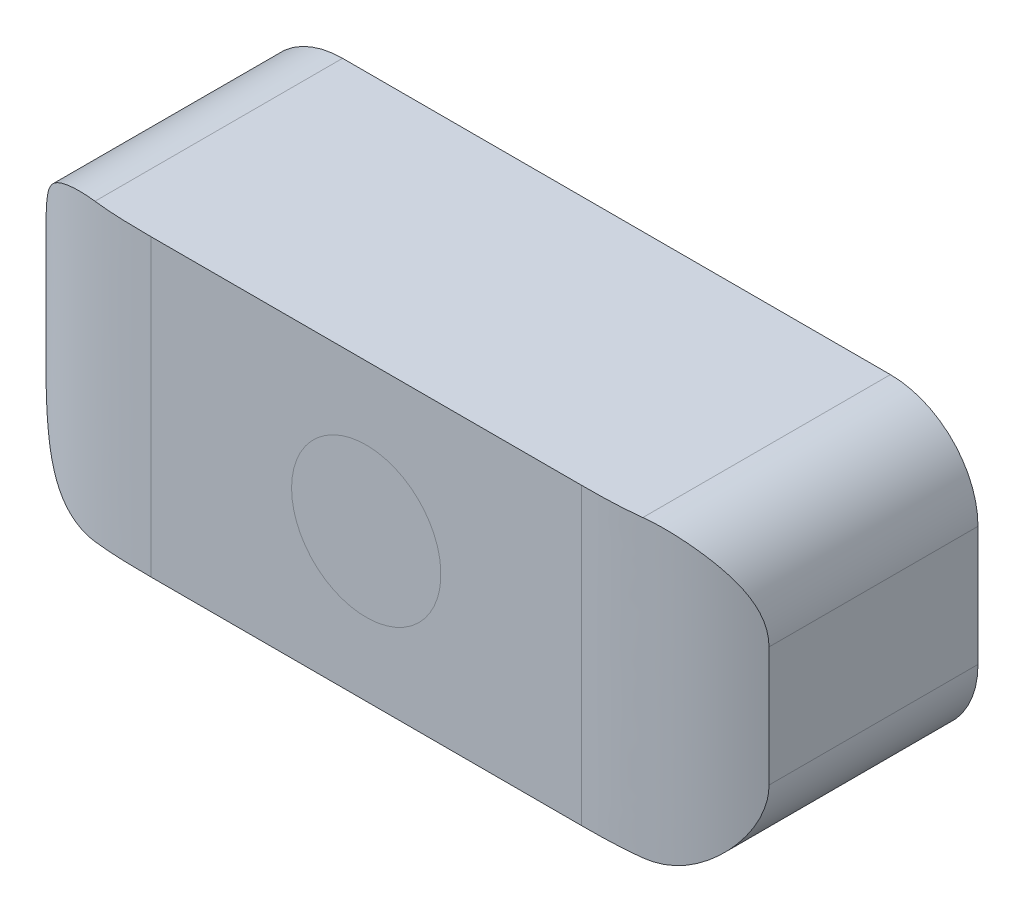
ISO-10303-21;
HEADER;
FILE_DESCRIPTION(('STEP AP214'),'2;1');
FILE_NAME('part.step','',(''),(''),'','','');
FILE_SCHEMA(('AUTOMOTIVE_DESIGN { 1 0 10303 214 1 1 1 1 }'));
ENDSEC;
DATA;
#1=APPLICATION_CONTEXT('core data for automotive mechanical design processes');
#2=APPLICATION_PROTOCOL_DEFINITION('international standard','automotive_design',2000,#1);
#3=PRODUCT_CONTEXT('',#1,'mechanical');
#4=PRODUCT('Part','Part','',(#3));
#5=PRODUCT_RELATED_PRODUCT_CATEGORY('part','',(#4));
#6=PRODUCT_DEFINITION_FORMATION('','',#4);
#7=PRODUCT_DEFINITION_CONTEXT('part definition',#1,'design');
#8=PRODUCT_DEFINITION('design','',#6,#7);
#9=PRODUCT_DEFINITION_SHAPE('','',#8);
#10=(LENGTH_UNIT() NAMED_UNIT(*) SI_UNIT(.MILLI.,.METRE.));
#11=(NAMED_UNIT(*) PLANE_ANGLE_UNIT() SI_UNIT($,.RADIAN.));
#12=(NAMED_UNIT(*) SI_UNIT($,.STERADIAN.) SOLID_ANGLE_UNIT());
#13=UNCERTAINTY_MEASURE_WITH_UNIT(LENGTH_MEASURE(1.E-05),#10,'distance_accuracy_value','');
#14=(GEOMETRIC_REPRESENTATION_CONTEXT(3) GLOBAL_UNCERTAINTY_ASSIGNED_CONTEXT((#13)) GLOBAL_UNIT_ASSIGNED_CONTEXT((#10,
#11,#12)) REPRESENTATION_CONTEXT('',''));
#15=CARTESIAN_POINT('',(0.,0.,0.));
#16=DIRECTION('',(0.,0.,1.));
#17=DIRECTION('',(1.,0.,0.));
#18=AXIS2_PLACEMENT_3D('',#15,#16,#17);
#19=CARTESIAN_POINT('',(41.275,-16.8275,14.2875));
#20=DIRECTION('',(0.,0.,-1.));
#21=DIRECTION('',(-1.,0.,0.));
#22=AXIS2_PLACEMENT_3D('',#19,#20,#21);
#23=PLANE('',#22);
#24=DIRECTION('',(-1.,0.,0.));
#25=VECTOR('',#24,1.);
#26=CARTESIAN_POINT('',(41.275,-16.8275,14.2875));
#27=LINE('',#26,#25);
#28=CARTESIAN_POINT('',(24.5753628077064,-16.8275,14.2875));
#29=VERTEX_POINT('',#28);
#30=CARTESIAN_POINT('',(-24.5753628077064,-16.8275,14.2875));
#31=VERTEX_POINT('',#30);
#32=EDGE_CURVE('E128',#29,#31,#27,.T.);
#33=ORIENTED_EDGE('',*,*,#32,.F.);
#34=DIRECTION('',(0.,1.,0.));
#35=VECTOR('',#34,1.);
#36=CARTESIAN_POINT('',(24.5753628077064,-16.8275,14.2875));
#37=LINE('',#36,#35);
#38=CARTESIAN_POINT('',(24.5753628077064,16.8275,14.2875));
#39=VERTEX_POINT('',#38);
#40=EDGE_CURVE('E113',#29,#39,#37,.T.);
#41=ORIENTED_EDGE('',*,*,#40,.T.);
#42=DIRECTION('',(-1.,0.,0.));
#43=VECTOR('',#42,1.);
#44=CARTESIAN_POINT('',(41.275,16.8275,14.2875));
#45=LINE('',#44,#43);
#46=CARTESIAN_POINT('',(-24.5753628077064,16.8275,14.2875));
#47=VERTEX_POINT('',#46);
#48=EDGE_CURVE('E294',#39,#47,#45,.T.);
#49=ORIENTED_EDGE('',*,*,#48,.T.);
#50=DIRECTION('',(0.,1.,0.));
#51=VECTOR('',#50,1.);
#52=CARTESIAN_POINT('',(-24.5753628077064,-16.8275,14.2875));
#53=LINE('',#52,#51);
#54=EDGE_CURVE('E136',#31,#47,#53,.T.);
#55=ORIENTED_EDGE('',*,*,#54,.F.);
#56=EDGE_LOOP('',(#33,#41,#49,#55));
#57=FACE_BOUND('',#56,.T.);
#58=CARTESIAN_POINT('',(0.,0.,14.2875));
#59=DIRECTION('',(0.,0.,-1.));
#60=DIRECTION('',(-1.,0.,0.));
#61=AXIS2_PLACEMENT_3D('',#58,#59,#60);
#62=CIRCLE('',#61,8.52461267126023);
#63=CARTESIAN_POINT('',(-8.52461267126023,0.,14.2875));
#64=VERTEX_POINT('',#63);
#65=EDGE_CURVE('E11',#64,#64,#62,.F.);
#66=ORIENTED_EDGE('',*,*,#65,.F.);
#67=EDGE_LOOP('',(#66));
#68=FACE_BOUND('',#67,.T.);
#69=ADVANCED_FACE('F35',(#57,#68),#23,.F.);
#70=ORIENTED_EDGE('',*,*,#65,.T.);
#71=EDGE_LOOP('',(#70));
#72=FACE_BOUND('',#71,.T.);
#73=ADVANCED_FACE('F230',(#72),#23,.F.);
#74=CARTESIAN_POINT('',(41.275,-16.8275,-14.2875));
#75=DIRECTION('',(0.,1.,0.));
#76=DIRECTION('',(0.,0.,1.));
#77=AXIS2_PLACEMENT_3D('',#74,#75,#76);
#78=PLANE('',#77);
#79=DIRECTION('',(0.,0.,-1.));
#80=VECTOR('',#79,1.);
#81=CARTESIAN_POINT('',(31.275,-16.8275,14.2875));
#82=LINE('',#81,#80);
#83=CARTESIAN_POINT('',(31.275,-16.8275,-14.2875));
#84=VERTEX_POINT('',#83);
#85=CARTESIAN_POINT('',(31.2750000000039,-16.8275,13.9790220721295));
#86=VERTEX_POINT('',#85);
#87=EDGE_CURVE('E132',#84,#86,#82,.F.);
#88=ORIENTED_EDGE('',*,*,#87,.T.);
#89=CARTESIAN_POINT('',(41.275,-16.8275,9.57373939648343));
#90=CARTESIAN_POINT('',(36.6084134772771,-16.8275,13.6105367528549));
#91=CARTESIAN_POINT('',(32.5382761892414,-16.8275,14.2875));
#92=CARTESIAN_POINT('',(24.5753628077064,-16.8275,14.2875));
#93=B_SPLINE_CURVE_WITH_KNOTS('',3,(#89,#90,#91,#92),.UNSPECIFIED.,.F.,.F.,(4,4),(0.,1.),.UNSPECIFIED.);
#94=EDGE_CURVE('E116',#86,#29,#93,.T.);
#95=ORIENTED_EDGE('',*,*,#94,.T.);
#96=ORIENTED_EDGE('',*,*,#32,.T.);
#97=CARTESIAN_POINT('',(-24.5753628077064,-16.8275,14.2875));
#98=CARTESIAN_POINT('',(-32.5382761892414,-16.8275,14.2875));
#99=CARTESIAN_POINT('',(-36.6084134772771,-16.8275,13.610536752855));
#100=CARTESIAN_POINT('',(-41.275,-16.8275,9.57373939648344));
#101=B_SPLINE_CURVE_WITH_KNOTS('',3,(#97,#98,#99,#100),.UNSPECIFIED.,.F.,.F.,(4,4),(0.,1.),.UNSPECIFIED.);
#102=CARTESIAN_POINT('',(-31.2750000000039,-16.8275,13.9790220721295));
#103=VERTEX_POINT('',#102);
#104=EDGE_CURVE('E191',#31,#103,#101,.T.);
#105=ORIENTED_EDGE('',*,*,#104,.T.);
#106=DIRECTION('',(0.,0.,-1.));
#107=VECTOR('',#106,1.);
#108=CARTESIAN_POINT('',(-31.275,-16.8275,-14.2875));
#109=LINE('',#108,#107);
#110=CARTESIAN_POINT('',(-31.275,-16.8275,-14.2875));
#111=VERTEX_POINT('',#110);
#112=EDGE_CURVE('E139',#103,#111,#109,.T.);
#113=ORIENTED_EDGE('',*,*,#112,.T.);
#114=DIRECTION('',(-1.,0.,0.));
#115=VECTOR('',#114,1.);
#116=CARTESIAN_POINT('',(41.275,-16.8275,-14.2875));
#117=LINE('',#116,#115);
#118=EDGE_CURVE('E137',#84,#111,#117,.T.);
#119=ORIENTED_EDGE('',*,*,#118,.F.);
#120=EDGE_LOOP('',(#88,#95,#96,#105,#113,#119));
#121=FACE_BOUND('',#120,.T.);
#122=ADVANCED_FACE('F126',(#121),#78,.F.);
#123=CARTESIAN_POINT('',(41.275,-16.8275,-14.2875));
#124=DIRECTION('',(0.,0.,1.));
#125=DIRECTION('',(1.,0.,0.));
#126=AXIS2_PLACEMENT_3D('',#123,#124,#125);
#127=PLANE('',#126);
#128=ORIENTED_EDGE('',*,*,#118,.T.);
#129=CARTESIAN_POINT('',(-31.275,-6.8275,-14.2875));
#130=DIRECTION('',(0.,0.,1.));
#131=DIRECTION('',(1.,0.,0.));
#132=AXIS2_PLACEMENT_3D('',#129,#130,#131);
#133=CIRCLE('',#132,10.);
#134=CARTESIAN_POINT('',(-41.275,-6.8275,-14.2875));
#135=VERTEX_POINT('',#134);
#136=EDGE_CURVE('E153',#111,#135,#133,.F.);
#137=ORIENTED_EDGE('',*,*,#136,.T.);
#138=DIRECTION('',(0.,1.,0.));
#139=VECTOR('',#138,1.);
#140=CARTESIAN_POINT('',(-41.275,-16.8275,-14.2875));
#141=LINE('',#140,#139);
#142=CARTESIAN_POINT('',(-41.275,6.8275,-14.2875));
#143=VERTEX_POINT('',#142);
#144=EDGE_CURVE('E220',#135,#143,#141,.T.);
#145=ORIENTED_EDGE('',*,*,#144,.T.);
#146=CARTESIAN_POINT('',(-31.275,6.8275,-14.2875));
#147=DIRECTION('',(0.,0.,1.));
#148=DIRECTION('',(1.,0.,0.));
#149=AXIS2_PLACEMENT_3D('',#146,#147,#148);
#150=CIRCLE('',#149,10.);
#151=CARTESIAN_POINT('',(-31.275,16.8275,-14.2875));
#152=VERTEX_POINT('',#151);
#153=EDGE_CURVE('E149',#143,#152,#150,.F.);
#154=ORIENTED_EDGE('',*,*,#153,.T.);
#155=DIRECTION('',(-1.,0.,0.));
#156=VECTOR('',#155,1.);
#157=CARTESIAN_POINT('',(41.275,16.8275,-14.2875));
#158=LINE('',#157,#156);
#159=CARTESIAN_POINT('',(31.275,16.8275,-14.2875));
#160=VERTEX_POINT('',#159);
#161=EDGE_CURVE('E142',#160,#152,#158,.T.);
#162=ORIENTED_EDGE('',*,*,#161,.F.);
#163=CARTESIAN_POINT('',(31.275,6.8275,-14.2875));
#164=DIRECTION('',(0.,0.,1.));
#165=DIRECTION('',(1.,0.,0.));
#166=AXIS2_PLACEMENT_3D('',#163,#164,#165);
#167=CIRCLE('',#166,10.);
#168=CARTESIAN_POINT('',(41.275,6.8275,-14.2875));
#169=VERTEX_POINT('',#168);
#170=EDGE_CURVE('E147',#160,#169,#167,.F.);
#171=ORIENTED_EDGE('',*,*,#170,.T.);
#172=DIRECTION('',(0.,1.,0.));
#173=VECTOR('',#172,1.);
#174=CARTESIAN_POINT('',(41.275,-16.8275,-14.2875));
#175=LINE('',#174,#173);
#176=CARTESIAN_POINT('',(41.275,-6.8275,-14.2875));
#177=VERTEX_POINT('',#176);
#178=EDGE_CURVE('E221',#177,#169,#175,.T.);
#179=ORIENTED_EDGE('',*,*,#178,.F.);
#180=CARTESIAN_POINT('',(31.275,-6.8275,-14.2875));
#181=DIRECTION('',(0.,0.,1.));
#182=DIRECTION('',(1.,0.,0.));
#183=AXIS2_PLACEMENT_3D('',#180,#181,#182);
#184=CIRCLE('',#183,10.);
#185=EDGE_CURVE('E151',#177,#84,#184,.F.);
#186=ORIENTED_EDGE('',*,*,#185,.T.);
#187=EDGE_LOOP('',(#128,#137,#145,#154,#162,#171,#179,#186));
#188=FACE_BOUND('',#187,.T.);
#189=ADVANCED_FACE('F247',(#188),#127,.F.);
#190=CARTESIAN_POINT('',(41.275,16.8275,-14.2875));
#191=DIRECTION('',(0.,-1.,0.));
#192=DIRECTION('',(0.,0.,-1.));
#193=AXIS2_PLACEMENT_3D('',#190,#191,#192);
#194=PLANE('',#193);
#195=ORIENTED_EDGE('',*,*,#48,.F.);
#196=CARTESIAN_POINT('',(41.275,16.8275,9.57373939648343));
#197=CARTESIAN_POINT('',(36.6084134772771,16.8275,13.610536752855));
#198=CARTESIAN_POINT('',(32.5382761892414,16.8275,14.2875));
#199=CARTESIAN_POINT('',(24.5753628077064,16.8275,14.2875));
#200=B_SPLINE_CURVE_WITH_KNOTS('',3,(#196,#197,#198,#199),.UNSPECIFIED.,.F.,.F.,(4,4),(0.,1.),.UNSPECIFIED.);
#201=CARTESIAN_POINT('',(31.2750000000039,16.8275,13.9790220721295));
#202=VERTEX_POINT('',#201);
#203=EDGE_CURVE('E119',#202,#39,#200,.T.);
#204=ORIENTED_EDGE('',*,*,#203,.F.);
#205=DIRECTION('',(0.,0.,1.));
#206=VECTOR('',#205,1.);
#207=CARTESIAN_POINT('',(31.275,16.8275,-14.2875));
#208=LINE('',#207,#206);
#209=EDGE_CURVE('E165',#202,#160,#208,.F.);
#210=ORIENTED_EDGE('',*,*,#209,.T.);
#211=ORIENTED_EDGE('',*,*,#161,.T.);
#212=DIRECTION('',(0.,0.,1.));
#213=VECTOR('',#212,1.);
#214=CARTESIAN_POINT('',(-31.275,16.8275,-14.2875));
#215=LINE('',#214,#213);
#216=CARTESIAN_POINT('',(-31.275,16.8275,13.9790220721295));
#217=VERTEX_POINT('',#216);
#218=EDGE_CURVE('E167',#152,#217,#215,.T.);
#219=ORIENTED_EDGE('',*,*,#218,.T.);
#220=CARTESIAN_POINT('',(-24.5753628077064,16.8275,14.2875));
#221=CARTESIAN_POINT('',(-32.5382761892414,16.8275,14.2875));
#222=CARTESIAN_POINT('',(-36.6084134772771,16.8275,13.610536752855));
#223=CARTESIAN_POINT('',(-41.275,16.8275,9.57373939648344));
#224=B_SPLINE_CURVE_WITH_KNOTS('',3,(#220,#221,#222,#223),.UNSPECIFIED.,.F.,.F.,(4,4),(0.,1.),.UNSPECIFIED.);
#225=EDGE_CURVE('E60',#47,#217,#224,.T.);
#226=ORIENTED_EDGE('',*,*,#225,.F.);
#227=EDGE_LOOP('',(#195,#204,#210,#211,#219,#226));
#228=FACE_BOUND('',#227,.T.);
#229=ADVANCED_FACE('F252',(#228),#194,.F.);
#230=CARTESIAN_POINT('',(41.275,0.,0.));
#231=DIRECTION('',(1.,0.,0.));
#232=DIRECTION('',(0.,0.,-1.));
#233=AXIS2_PLACEMENT_3D('',#230,#231,#232);
#234=PLANE('',#233);
#235=DIRECTION('',(0.,1.,0.));
#236=VECTOR('',#235,1.);
#237=CARTESIAN_POINT('',(41.275,-16.8275,9.57373939648344));
#238=LINE('',#237,#236);
#239=CARTESIAN_POINT('',(41.275,-6.82750000000001,9.57373939648344));
#240=VERTEX_POINT('',#239);
#241=CARTESIAN_POINT('',(41.275,6.82749999999999,9.57373939648344));
#242=VERTEX_POINT('',#241);
#243=EDGE_CURVE('E52',#240,#242,#238,.T.);
#244=ORIENTED_EDGE('',*,*,#243,.F.);
#245=DIRECTION('',(0.,0.,-1.));
#246=VECTOR('',#245,1.);
#247=CARTESIAN_POINT('',(41.275,-6.8275,-14.2875));
#248=LINE('',#247,#246);
#249=EDGE_CURVE('E163',#240,#177,#248,.T.);
#250=ORIENTED_EDGE('',*,*,#249,.T.);
#251=ORIENTED_EDGE('',*,*,#178,.T.);
#252=DIRECTION('',(0.,0.,1.));
#253=VECTOR('',#252,1.);
#254=CARTESIAN_POINT('',(41.275,6.82749999999999,14.2875));
#255=LINE('',#254,#253);
#256=EDGE_CURVE('E160',#169,#242,#255,.T.);
#257=ORIENTED_EDGE('',*,*,#256,.T.);
#258=EDGE_LOOP('',(#244,#250,#251,#257));
#259=FACE_BOUND('',#258,.T.);
#260=ADVANCED_FACE('F188',(#259),#234,.T.);
#261=CARTESIAN_POINT('',(-41.275,0.,0.));
#262=DIRECTION('',(1.,0.,0.));
#263=DIRECTION('',(0.,0.,-1.));
#264=AXIS2_PLACEMENT_3D('',#261,#262,#263);
#265=PLANE('',#264);
#266=DIRECTION('',(0.,0.,-1.));
#267=VECTOR('',#266,1.);
#268=CARTESIAN_POINT('',(-41.275,-6.8275,0.));
#269=LINE('',#268,#267);
#270=CARTESIAN_POINT('',(-41.275,-6.82750000000001,9.57373939648344));
#271=VERTEX_POINT('',#270);
#272=EDGE_CURVE('E157',#135,#271,#269,.F.);
#273=ORIENTED_EDGE('',*,*,#272,.T.);
#274=DIRECTION('',(0.,1.,0.));
#275=VECTOR('',#274,1.);
#276=CARTESIAN_POINT('',(-41.275,-16.8275,9.57373939648344));
#277=LINE('',#276,#275);
#278=CARTESIAN_POINT('',(-41.275,6.82749999999999,9.57373939648344));
#279=VERTEX_POINT('',#278);
#280=EDGE_CURVE('E197',#271,#279,#277,.T.);
#281=ORIENTED_EDGE('',*,*,#280,.T.);
#282=DIRECTION('',(0.,0.,1.));
#283=VECTOR('',#282,1.);
#284=CARTESIAN_POINT('',(-41.275,6.8275,0.));
#285=LINE('',#284,#283);
#286=EDGE_CURVE('E155',#279,#143,#285,.F.);
#287=ORIENTED_EDGE('',*,*,#286,.T.);
#288=ORIENTED_EDGE('',*,*,#144,.F.);
#289=EDGE_LOOP('',(#273,#281,#287,#288));
#290=FACE_BOUND('',#289,.T.);
#291=ADVANCED_FACE('F228',(#290),#265,.F.);
#292=CARTESIAN_POINT('',(-31.275,-6.8275,-14.2875));
#293=DIRECTION('',(0.,0.,-1.));
#294=DIRECTION('',(0.,1.,0.));
#295=AXIS2_PLACEMENT_3D('',#292,#293,#294);
#296=CYLINDRICAL_SURFACE('',#295,10.);
#297=CARTESIAN_POINT('',(-41.275,-6.82750000000001,9.57373939648343));
#298=CARTESIAN_POINT('',(-41.2750017122999,-6.94897907164037,9.5737358733099));
#299=CARTESIAN_POINT('',(-41.2727858087764,-7.07043875838782,9.57565501888381));
#300=CARTESIAN_POINT('',(-41.2639416995506,-7.31306896861075,9.58330121349026));
#301=CARTESIAN_POINT('',(-41.2573138046995,-7.43423951185454,9.58902799425216));
#302=CARTESIAN_POINT('',(-41.2308685336129,-7.79665948075891,9.61184465866607));
#303=CARTESIAN_POINT('',(-41.2044894449143,-8.03712800808981,9.63457105776755));
#304=CARTESIAN_POINT('',(-41.1350796811219,-8.51147842287139,9.69397283939904));
#305=CARTESIAN_POINT('',(-41.0922086495195,-8.745401071324,9.73051443296276));
#306=CARTESIAN_POINT('',(-40.990556074068,-9.20740095487234,9.81636063583321));
#307=CARTESIAN_POINT('',(-40.931771340507,-9.43547700804413,9.86566780376064));
#308=CARTESIAN_POINT('',(-40.7994490754553,-9.88351312285187,9.97533648229417));
#309=CARTESIAN_POINT('',(-40.7259713756581,-10.1035019496056,10.0356530769034));
#310=CARTESIAN_POINT('',(-40.5650614093231,-10.5353143531225,10.1658108625564));
#311=CARTESIAN_POINT('',(-40.4776294895544,-10.7471381326287,10.235651816909));
#312=CARTESIAN_POINT('',(-40.1951919667353,-11.3704582176016,10.4573283875502));
#313=CARTESIAN_POINT('',(-39.9802952155237,-11.7689701852569,10.6211029313852));
#314=CARTESIAN_POINT('',(-39.6070710298788,-12.3629390286582,10.8915886864213));
#315=CARTESIAN_POINT('',(-39.4645873442612,-12.5715500493972,10.9922713172047));
#316=CARTESIAN_POINT('',(-39.1651415382588,-12.9764024459976,11.1971388489256));
#317=CARTESIAN_POINT('',(-39.0081785865895,-13.1726431105611,11.3013239507286));
#318=CARTESIAN_POINT('',(-38.6802537016666,-13.5524704274164,11.5109805531455));
#319=CARTESIAN_POINT('',(-38.5092851205362,-13.7360509934597,11.6164526441872));
#320=CARTESIAN_POINT('',(-38.1537404236502,-14.0901349126843,11.8265285577913));
#321=CARTESIAN_POINT('',(-37.969163033676,-14.260637038249,11.9311322980255));
#322=CARTESIAN_POINT('',(-37.6247579142283,-14.5554522246232,12.1169346907308));
#323=CARTESIAN_POINT('',(-37.4672980929494,-14.682212122166,12.1986546600182));
#324=CARTESIAN_POINT('',(-37.1440280712011,-14.9266090866057,12.3592763053982));
#325=CARTESIAN_POINT('',(-36.978216897229,-15.0442450858669,12.4381776510878));
#326=CARTESIAN_POINT('',(-36.6384992188857,-15.2699203915895,12.5922628127601));
#327=CARTESIAN_POINT('',(-36.4645919845337,-15.3779588301231,12.6674462922564));
#328=CARTESIAN_POINT('',(-36.1093221646363,-15.5837203791989,12.8131836415548));
#329=CARTESIAN_POINT('',(-35.9279720260374,-15.6814598087249,12.8837447663389));
#330=CARTESIAN_POINT('',(-35.5580297519339,-15.8662166882258,13.0197129261647));
#331=CARTESIAN_POINT('',(-35.3694380674619,-15.9532348045507,13.0851202814318));
#332=CARTESIAN_POINT('',(-34.9856341915826,-16.1159132082144,13.2102819771047));
#333=CARTESIAN_POINT('',(-34.7904233801649,-16.1915758453689,13.2700374861112));
#334=CARTESIAN_POINT('',(-34.4184294727633,-16.3223833632075,13.3766254147075));
#335=CARTESIAN_POINT('',(-34.2423261254809,-16.3789067732892,13.4241437499779));
#336=CARTESIAN_POINT('',(-33.8861514601214,-16.4823575128061,13.5145126466976));
#337=CARTESIAN_POINT('',(-33.706080331112,-16.5292852983895,13.5573634299835));
#338=CARTESIAN_POINT('',(-33.3426106746145,-16.6131921996112,13.6384131789722));
#339=CARTESIAN_POINT('',(-33.1592122585479,-16.6501716477375,13.676612300117));
#340=CARTESIAN_POINT('',(-32.7886145842418,-16.7140844050324,13.7487004727628));
#341=CARTESIAN_POINT('',(-32.6013987657679,-16.7409536969376,13.7825611923994));
#342=CARTESIAN_POINT('',(-32.224989979512,-16.7840753487603,13.8458952390734));
#343=CARTESIAN_POINT('',(-32.0357967736866,-16.8003264151149,13.8753680312151));
#344=CARTESIAN_POINT('',(-31.6561473012656,-16.8220460651761,13.9302079687424));
#345=CARTESIAN_POINT('',(-31.4656907051075,-16.8275117147781,13.9555739951862));
#346=CARTESIAN_POINT('',(-31.275,-16.8275,13.97902207213));
#347=B_SPLINE_CURVE_WITH_KNOTS('',3,(#297,#298,#299,#300,#301,#302,#303,#304,#305,#306,#307,
#308,#309,#310,#311,#312,#313,#314,#315,#316,#317,#318,#319,#320,#321,#322,#323,#324,#325,#326,
#327,#328,#329,#330,#331,#332,#333,#334,#335,#336,#337,#338,#339,#340,#341,#342,#343,#344,#345,
#346),.UNSPECIFIED.,.F.,.F.,(4,2,2,2,2,2,2,2,2,2,2,2,2,2,2,2,2,2,2,2,2,2,2,2,4),(0.,
0.364363783274318,0.728701897663252,1.45644971781649,2.17732327951983,2.89834143885684,
3.61648121190833,4.33460314162307,5.77350875418264,6.58884105603781,7.40422019696402,
8.21998863147997,9.03583354517984,9.68959964887008,10.3434421381302,10.9973436956788,
11.6501930390387,12.3030017860809,12.9556752590821,13.5282242205352,14.1007459583377,
14.6732485592456,15.2493175537385,15.8254567146201,16.4017525889327),.UNSPECIFIED.);
#348=EDGE_CURVE('E212',#271,#103,#347,.T.);
#349=ORIENTED_EDGE('',*,*,#348,.F.);
#350=ORIENTED_EDGE('',*,*,#272,.F.);
#351=ORIENTED_EDGE('',*,*,#136,.F.);
#352=ORIENTED_EDGE('',*,*,#112,.F.);
#353=EDGE_LOOP('',(#349,#350,#351,#352));
#354=FACE_BOUND('',#353,.T.);
#355=ADVANCED_FACE('F223',(#354),#296,.T.);
#356=CARTESIAN_POINT('',(31.275,-6.8275,0.));
#357=DIRECTION('',(0.,0.,1.));
#358=DIRECTION('',(0.,-1.,0.));
#359=AXIS2_PLACEMENT_3D('',#356,#357,#358);
#360=CYLINDRICAL_SURFACE('',#359,10.);
#361=CARTESIAN_POINT('',(31.275,-16.8275,13.97902207213));
#362=CARTESIAN_POINT('',(31.4563798845068,-16.8275095600596,13.9567176196989));
#363=CARTESIAN_POINT('',(31.6375480664986,-16.8225656029066,13.9326795703528));
#364=CARTESIAN_POINT('',(31.9987950828875,-16.8029090678921,13.8808965255612));
#365=CARTESIAN_POINT('',(32.1788740680223,-16.7881978744818,13.8531520559254));
#366=CARTESIAN_POINT('',(32.5373173932018,-16.7491464176737,13.7937120794796));
#367=CARTESIAN_POINT('',(32.7156818389942,-16.7248067520852,13.7620168180486));
#368=CARTESIAN_POINT('',(33.0691443277492,-16.6668571146076,13.694672256989));
#369=CARTESIAN_POINT('',(33.2442546221765,-16.633296612933,13.659044648278));
#370=CARTESIAN_POINT('',(33.5915707645889,-16.5570994863072,13.5835867895368));
#371=CARTESIAN_POINT('',(33.7637766481425,-16.5144629725918,13.5437565910167));
#372=CARTESIAN_POINT('',(34.1047078441492,-16.4204157278727,13.4598667197627));
#373=CARTESIAN_POINT('',(34.273433272387,-16.3690052892821,13.4158071880035));
#374=CARTESIAN_POINT('',(34.6902482789489,-16.2299219564145,13.3004281210021));
#375=CARTESIAN_POINT('',(34.9358738045701,-16.1369644756325,13.2264868459228));
#376=CARTESIAN_POINT('',(35.4166581166428,-15.933260085058,13.0697437320877));
#377=CARTESIAN_POINT('',(35.6518165764094,-15.8225126205236,12.9869416170528));
#378=CARTESIAN_POINT('',(36.1107695960887,-15.5843395667504,12.8133991046854));
#379=CARTESIAN_POINT('',(36.3345530641037,-15.456898116196,12.7226511854109));
#380=CARTESIAN_POINT('',(36.7696976317904,-15.1865624452974,12.5346756547256));
#381=CARTESIAN_POINT('',(36.9810583145035,-15.0436677067353,12.4374478260565));
#382=CARTESIAN_POINT('',(37.4026268136249,-14.7347348847145,12.2324464409518));
#383=CARTESIAN_POINT('',(37.6120660529722,-14.5678375921626,12.1243880531502));
#384=CARTESIAN_POINT('',(38.0159979689911,-14.2187268160846,11.905140184122));
#385=CARTESIAN_POINT('',(38.2104896031676,-14.0365122661347,11.7939504852452));
#386=CARTESIAN_POINT('',(38.5843585542657,-13.6571593587499,11.5707337213539));
#387=CARTESIAN_POINT('',(38.7637191020057,-13.4600048914943,11.4587058732853));
#388=CARTESIAN_POINT('',(39.10655075008,-13.0514849736245,11.2365565493462));
#389=CARTESIAN_POINT('',(39.2700226592781,-12.8401202473584,11.1264349766652));
#390=CARTESIAN_POINT('',(39.721242422149,-12.2053777533538,10.8129885307414));
#391=CARTESIAN_POINT('',(39.9876208749145,-11.7631930288925,10.6154770325646));
#392=CARTESIAN_POINT('',(40.3362696700211,-11.0655124536873,10.3471189673088));
#393=CARTESIAN_POINT('',(40.4438760253082,-10.8276008057271,10.2624240283));
#394=CARTESIAN_POINT('',(40.6412499157208,-10.3406612262001,10.1046286956397));
#395=CARTESIAN_POINT('',(40.7310186640778,-10.0916340520718,10.0315275135029));
#396=CARTESIAN_POINT('',(40.885962700269,-9.60079371766028,9.90386678160821));
#397=CARTESIAN_POINT('',(40.9523801426962,-9.35960963449886,9.84839492861276));
#398=CARTESIAN_POINT('',(41.0673623022864,-8.87022688424891,9.75161480607119));
#399=CARTESIAN_POINT('',(41.1159325000177,-8.62203039579846,9.71030218874065));
#400=CARTESIAN_POINT('',(41.1749203842731,-8.24456902300469,9.65989189577121));
#401=CARTESIAN_POINT('',(41.192332675673,-8.11711899241605,9.64496168139645));
#402=CARTESIAN_POINT('',(41.2222614724874,-7.86121897894332,9.61924915874016));
#403=CARTESIAN_POINT('',(41.2347780499209,-7.73276901079729,9.60846678944125));
#404=CARTESIAN_POINT('',(41.2548514499789,-7.47502699137176,9.59115568117043));
#405=CARTESIAN_POINT('',(41.2624017202361,-7.34573405399901,9.58463256178256));
#406=CARTESIAN_POINT('',(41.2724787652612,-7.08679535728535,9.57592028279586));
#407=CARTESIAN_POINT('',(41.2750050785203,-6.95714956662607,9.57373152135838));
#408=CARTESIAN_POINT('',(41.275,-6.82750000000001,9.57373939648343));
#409=B_SPLINE_CURVE_WITH_KNOTS('',3,(#361,#362,#363,#364,#365,#366,#367,#368,#369,#370,#371,
#372,#373,#374,#375,#376,#377,#378,#379,#380,#381,#382,#383,#384,#385,#386,#387,#388,#389,#390,
#391,#392,#393,#394,#395,#396,#397,#398,#399,#400,#401,#402,#403,#404,#405,#406,#407,#408),
.UNSPECIFIED.,.F.,.F.,(4,2,2,2,2,2,2,2,2,2,2,2,2,2,2,2,2,2,2,2,2,2,2,4),(0.,0.548165340347045,
1.09625299790181,1.64430663132206,2.18947549005585,2.73463766757519,3.27978167974701,
4.09728262312385,4.91480906344094,5.73311796485094,6.55145431633469,7.41695661000415,
8.28251921197789,9.14902881430241,10.0154942809529,11.6658663017792,12.4885881938521,
13.3112541090222,14.0789737014756,14.8464573436181,15.2348150793937,15.6231671019673,
16.0120304799473,16.4009295779096),.UNSPECIFIED.);
#410=EDGE_CURVE('E198',#86,#240,#409,.T.);
#411=ORIENTED_EDGE('',*,*,#410,.F.);
#412=ORIENTED_EDGE('',*,*,#87,.F.);
#413=ORIENTED_EDGE('',*,*,#185,.F.);
#414=ORIENTED_EDGE('',*,*,#249,.F.);
#415=EDGE_LOOP('',(#411,#412,#413,#414));
#416=FACE_BOUND('',#415,.T.);
#417=ADVANCED_FACE('F227',(#416),#360,.T.);
#418=CARTESIAN_POINT('',(-31.275,6.8275,-14.2875));
#419=DIRECTION('',(0.,0.,1.));
#420=DIRECTION('',(0.,-1.,0.));
#421=AXIS2_PLACEMENT_3D('',#418,#419,#420);
#422=CYLINDRICAL_SURFACE('',#421,10.);
#423=CARTESIAN_POINT('',(-31.275,16.8275,13.97902207213));
#424=CARTESIAN_POINT('',(-31.4563798845068,16.8275095600596,13.9567176196989));
#425=CARTESIAN_POINT('',(-31.6375480664986,16.8225656029066,13.9326795703528));
#426=CARTESIAN_POINT('',(-31.9987950828875,16.8029090678921,13.8808965255613));
#427=CARTESIAN_POINT('',(-32.1788740680223,16.7881978744818,13.8531520559254));
#428=CARTESIAN_POINT('',(-32.5373173932018,16.7491464176737,13.7937120794796));
#429=CARTESIAN_POINT('',(-32.7156818389942,16.7248067520852,13.7620168180486));
#430=CARTESIAN_POINT('',(-33.0691443277492,16.6668571146075,13.694672256989));
#431=CARTESIAN_POINT('',(-33.2442546221765,16.633296612933,13.659044648278));
#432=CARTESIAN_POINT('',(-33.5915707645889,16.5570994863072,13.5835867895368));
#433=CARTESIAN_POINT('',(-33.7637766481426,16.5144629725918,13.5437565910167));
#434=CARTESIAN_POINT('',(-34.1047078441492,16.4204157278727,13.4598667197628));
#435=CARTESIAN_POINT('',(-34.2734332723871,16.3690052892821,13.4158071880035));
#436=CARTESIAN_POINT('',(-34.6902482789489,16.2299219564145,13.3004281210021));
#437=CARTESIAN_POINT('',(-34.9358738045701,16.1369644756325,13.2264868459228));
#438=CARTESIAN_POINT('',(-35.4166581166428,15.933260085058,13.0697437320877));
#439=CARTESIAN_POINT('',(-35.6518165764094,15.8225126205236,12.9869416170528));
#440=CARTESIAN_POINT('',(-36.1107695960888,15.5843395667504,12.8133991046855));
#441=CARTESIAN_POINT('',(-36.3345530641038,15.456898116196,12.7226511854109));
#442=CARTESIAN_POINT('',(-36.7696976317905,15.1865624452974,12.5346756547256));
#443=CARTESIAN_POINT('',(-36.9810583145035,15.0436677067353,12.4374478260565));
#444=CARTESIAN_POINT('',(-37.4026268136249,14.7347348847145,12.2324464409518));
#445=CARTESIAN_POINT('',(-37.6120660529722,14.5678375921626,12.1243880531502));
#446=CARTESIAN_POINT('',(-38.0159979689911,14.2187268160846,11.905140184122));
#447=CARTESIAN_POINT('',(-38.2104896031676,14.0365122661347,11.7939504852452));
#448=CARTESIAN_POINT('',(-38.5843585542657,13.6571593587499,11.5707337213539));
#449=CARTESIAN_POINT('',(-38.7637191020057,13.4600048914943,11.4587058732853));
#450=CARTESIAN_POINT('',(-39.10655075008,13.0514849736244,11.2365565493462));
#451=CARTESIAN_POINT('',(-39.2700226592781,12.8401202473583,11.1264349766653));
#452=CARTESIAN_POINT('',(-39.721242422149,12.2053777533538,10.8129885307414));
#453=CARTESIAN_POINT('',(-39.9876208749145,11.7631930288925,10.6154770325646));
#454=CARTESIAN_POINT('',(-40.3362696700211,11.0655124536873,10.3471189673088));
#455=CARTESIAN_POINT('',(-40.4438760253082,10.8276008057271,10.2624240283));
#456=CARTESIAN_POINT('',(-40.6412499157208,10.3406612262001,10.1046286956397));
#457=CARTESIAN_POINT('',(-40.7310186640778,10.0916340520718,10.0315275135029));
#458=CARTESIAN_POINT('',(-40.885962700269,9.60079371766027,9.90386678160822));
#459=CARTESIAN_POINT('',(-40.9523801426962,9.35960963449886,9.84839492861277));
#460=CARTESIAN_POINT('',(-41.0673623022864,8.8702268842489,9.75161480607121));
#461=CARTESIAN_POINT('',(-41.1159325000177,8.62203039579845,9.71030218874068));
#462=CARTESIAN_POINT('',(-41.1749203842731,8.24456902300468,9.65989189577124));
#463=CARTESIAN_POINT('',(-41.192332675673,8.11711899241604,9.64496168139647));
#464=CARTESIAN_POINT('',(-41.2222614724874,7.86121897894331,9.61924915874017));
#465=CARTESIAN_POINT('',(-41.234778049921,7.73276901079728,9.60846678944126));
#466=CARTESIAN_POINT('',(-41.2548514499789,7.47502699137175,9.59115568117045));
#467=CARTESIAN_POINT('',(-41.2624017202361,7.345734053999,9.58463256178258));
#468=CARTESIAN_POINT('',(-41.2724787652613,7.08679535728534,9.57592028279587));
#469=CARTESIAN_POINT('',(-41.2750050785203,6.95714956662606,9.5737315213584));
#470=CARTESIAN_POINT('',(-41.275,6.82749999999999,9.57373939648344));
#471=B_SPLINE_CURVE_WITH_KNOTS('',3,(#423,#424,#425,#426,#427,#428,#429,#430,#431,#432,#433,
#434,#435,#436,#437,#438,#439,#440,#441,#442,#443,#444,#445,#446,#447,#448,#449,#450,#451,#452,
#453,#454,#455,#456,#457,#458,#459,#460,#461,#462,#463,#464,#465,#466,#467,#468,#469,#470),
.UNSPECIFIED.,.F.,.F.,(4,2,2,2,2,2,2,2,2,2,2,2,2,2,2,2,2,2,2,2,2,2,2,4),(0.,0.548165340347045,
1.09625299790181,1.64430663132205,2.18947549005585,2.73463766757521,3.27978167974702,
4.09728262312386,4.91480906344096,5.73311796485096,6.5514543163347,7.41695661000416,
8.2825192119779,9.14902881430241,10.0154942809529,11.6658663017792,12.4885881938521,
13.3112541090222,14.0789737014756,14.8464573436181,15.2348150793937,15.6231671019673,
16.0120304799473,16.4009295779096),.UNSPECIFIED.);
#472=EDGE_CURVE('E170',#217,#279,#471,.T.);
#473=ORIENTED_EDGE('',*,*,#472,.F.);
#474=ORIENTED_EDGE('',*,*,#218,.F.);
#475=ORIENTED_EDGE('',*,*,#153,.F.);
#476=ORIENTED_EDGE('',*,*,#286,.F.);
#477=EDGE_LOOP('',(#473,#474,#475,#476));
#478=FACE_BOUND('',#477,.T.);
#479=ADVANCED_FACE('F179',(#478),#422,.T.);
#480=CARTESIAN_POINT('',(31.275,6.8275,0.));
#481=DIRECTION('',(0.,0.,-1.));
#482=DIRECTION('',(0.,1.,0.));
#483=AXIS2_PLACEMENT_3D('',#480,#481,#482);
#484=CYLINDRICAL_SURFACE('',#483,10.);
#485=CARTESIAN_POINT('',(41.275,6.82749999999999,9.57373939648343));
#486=CARTESIAN_POINT('',(41.2750017122999,6.94897907164036,9.5737358733099));
#487=CARTESIAN_POINT('',(41.2727858087764,7.07043875838781,9.57565501888382));
#488=CARTESIAN_POINT('',(41.2639416995506,7.31306896861073,9.58330121349027));
#489=CARTESIAN_POINT('',(41.2573138046995,7.43423951185452,9.58902799425216));
#490=CARTESIAN_POINT('',(41.2308685336129,7.79665948075889,9.61184465866607));
#491=CARTESIAN_POINT('',(41.2044894449142,8.03712800808979,9.63457105776755));
#492=CARTESIAN_POINT('',(41.1350796811219,8.51147842287137,9.69397283939904));
#493=CARTESIAN_POINT('',(41.0922086495195,8.74540107132399,9.73051443296276));
#494=CARTESIAN_POINT('',(40.990556074068,9.20740095487233,9.81636063583321));
#495=CARTESIAN_POINT('',(40.931771340507,9.43547700804412,9.86566780376064));
#496=CARTESIAN_POINT('',(40.7994490754553,9.88351312285185,9.97533648229418));
#497=CARTESIAN_POINT('',(40.7259713756581,10.1035019496055,10.0356530769034));
#498=CARTESIAN_POINT('',(40.5650614093231,10.5353143531225,10.1658108625564));
#499=CARTESIAN_POINT('',(40.4776294895544,10.7471381326286,10.235651816909));
#500=CARTESIAN_POINT('',(40.1951919667353,11.3704582176016,10.4573283875502));
#501=CARTESIAN_POINT('',(39.9802952155238,11.7689701852569,10.6211029313852));
#502=CARTESIAN_POINT('',(39.6070710298788,12.3629390286581,10.8915886864212));
#503=CARTESIAN_POINT('',(39.4645873442612,12.5715500493972,10.9922713172047));
#504=CARTESIAN_POINT('',(39.1651415382588,12.9764024459975,11.1971388489255));
#505=CARTESIAN_POINT('',(39.0081785865896,13.1726431105611,11.3013239507285));
#506=CARTESIAN_POINT('',(38.6802537016666,13.5524704274163,11.5109805531455));
#507=CARTESIAN_POINT('',(38.5092851205362,13.7360509934597,11.6164526441872));
#508=CARTESIAN_POINT('',(38.1537404236502,14.0901349126843,11.8265285577913));
#509=CARTESIAN_POINT('',(37.9691630336761,14.260637038249,11.9311322980255));
#510=CARTESIAN_POINT('',(37.6247579142283,14.5554522246231,12.1169346907307));
#511=CARTESIAN_POINT('',(37.4672980929494,14.682212122166,12.1986546600182));
#512=CARTESIAN_POINT('',(37.1440280712011,14.9266090866056,12.3592763053982));
#513=CARTESIAN_POINT('',(36.978216897229,15.0442450858669,12.4381776510878));
#514=CARTESIAN_POINT('',(36.6384992188857,15.2699203915894,12.5922628127601));
#515=CARTESIAN_POINT('',(36.4645919845337,15.3779588301231,12.6674462922564));
#516=CARTESIAN_POINT('',(36.1093221646363,15.5837203791989,12.8131836415548));
#517=CARTESIAN_POINT('',(35.9279720260374,15.6814598087249,12.8837447663389));
#518=CARTESIAN_POINT('',(35.558029751934,15.8662166882258,13.0197129261647));
#519=CARTESIAN_POINT('',(35.3694380674619,15.9532348045507,13.0851202814318));
#520=CARTESIAN_POINT('',(34.9856341915826,16.1159132082144,13.2102819771047));
#521=CARTESIAN_POINT('',(34.7904233801649,16.1915758453689,13.2700374861112));
#522=CARTESIAN_POINT('',(34.4184294727633,16.3223833632074,13.3766254147075));
#523=CARTESIAN_POINT('',(34.2423261254809,16.3789067732891,13.4241437499779));
#524=CARTESIAN_POINT('',(33.8861514601214,16.4823575128061,13.5145126466975));
#525=CARTESIAN_POINT('',(33.706080331112,16.5292852983895,13.5573634299835));
#526=CARTESIAN_POINT('',(33.3426106746145,16.6131921996112,13.6384131789722));
#527=CARTESIAN_POINT('',(33.1592122585479,16.6501716477375,13.676612300117));
#528=CARTESIAN_POINT('',(32.7886145842418,16.7140844050324,13.7487004727629));
#529=CARTESIAN_POINT('',(32.6013987657679,16.7409536969376,13.7825611923994));
#530=CARTESIAN_POINT('',(32.224989979512,16.7840753487603,13.8458952390734));
#531=CARTESIAN_POINT('',(32.0357967736866,16.8003264151149,13.8753680312151));
#532=CARTESIAN_POINT('',(31.6561473012656,16.8220460651761,13.9302079687424));
#533=CARTESIAN_POINT('',(31.4656907051074,16.8275117147781,13.9555739951862));
#534=CARTESIAN_POINT('',(31.275,16.8275,13.97902207213));
#535=B_SPLINE_CURVE_WITH_KNOTS('',3,(#485,#486,#487,#488,#489,#490,#491,#492,#493,#494,#495,
#496,#497,#498,#499,#500,#501,#502,#503,#504,#505,#506,#507,#508,#509,#510,#511,#512,#513,#514,
#515,#516,#517,#518,#519,#520,#521,#522,#523,#524,#525,#526,#527,#528,#529,#530,#531,#532,#533,
#534),.UNSPECIFIED.,.F.,.F.,(4,2,2,2,2,2,2,2,2,2,2,2,2,2,2,2,2,2,2,2,2,2,2,2,4),(0.,
0.364363783274316,0.72870189766325,1.45644971781649,2.17732327951982,2.89834143885683,
3.61648121190832,4.33460314162305,5.77350875418262,6.58884105603778,7.40422019696398,
8.21998863147994,9.0358335451798,9.68959964887003,10.3434421381302,10.9973436956787,
11.6501930390386,12.3030017860809,12.9556752590821,13.5282242205352,14.1007459583377,
14.6732485592456,15.2493175537385,15.8254567146201,16.4017525889327),.UNSPECIFIED.);
#536=EDGE_CURVE('E45',#242,#202,#535,.T.);
#537=ORIENTED_EDGE('',*,*,#536,.F.);
#538=ORIENTED_EDGE('',*,*,#256,.F.);
#539=ORIENTED_EDGE('',*,*,#170,.F.);
#540=ORIENTED_EDGE('',*,*,#209,.F.);
#541=EDGE_LOOP('',(#537,#538,#539,#540));
#542=FACE_BOUND('',#541,.T.);
#543=ADVANCED_FACE('F37',(#542),#484,.T.);
#544=DIRECTION('',(0.,1.,0.));
#545=VECTOR('',#544,1.);
#546=SURFACE_OF_LINEAR_EXTRUSION('',#101,#545);
#547=ORIENTED_EDGE('',*,*,#348,.T.);
#548=ORIENTED_EDGE('',*,*,#104,.F.);
#549=ORIENTED_EDGE('',*,*,#54,.T.);
#550=ORIENTED_EDGE('',*,*,#225,.T.);
#551=ORIENTED_EDGE('',*,*,#472,.T.);
#552=ORIENTED_EDGE('',*,*,#280,.F.);
#553=EDGE_LOOP('',(#547,#548,#549,#550,#551,#552));
#554=FACE_BOUND('',#553,.T.);
#555=ADVANCED_FACE('F182',(#554),#546,.F.);
#556=DIRECTION('',(0.,1.,0.));
#557=VECTOR('',#556,1.);
#558=SURFACE_OF_LINEAR_EXTRUSION('',#93,#557);
#559=ORIENTED_EDGE('',*,*,#410,.T.);
#560=ORIENTED_EDGE('',*,*,#243,.T.);
#561=ORIENTED_EDGE('',*,*,#536,.T.);
#562=ORIENTED_EDGE('',*,*,#203,.T.);
#563=ORIENTED_EDGE('',*,*,#40,.F.);
#564=ORIENTED_EDGE('',*,*,#94,.F.);
#565=EDGE_LOOP('',(#559,#560,#561,#562,#563,#564));
#566=FACE_BOUND('',#565,.T.);
#567=ADVANCED_FACE('F115',(#566),#558,.F.);
#568=CLOSED_SHELL('',(#69,#73,#122,#189,#229,#260,#291,#355,#417,#479,#543,#555,#567));
#569=MANIFOLD_SOLID_BREP('B2',#568);
#570=ADVANCED_BREP_SHAPE_REPRESENTATION('',(#18,#569),#14);
#571=SHAPE_DEFINITION_REPRESENTATION(#9,#570);
ENDSEC;
END-ISO-10303-21;
